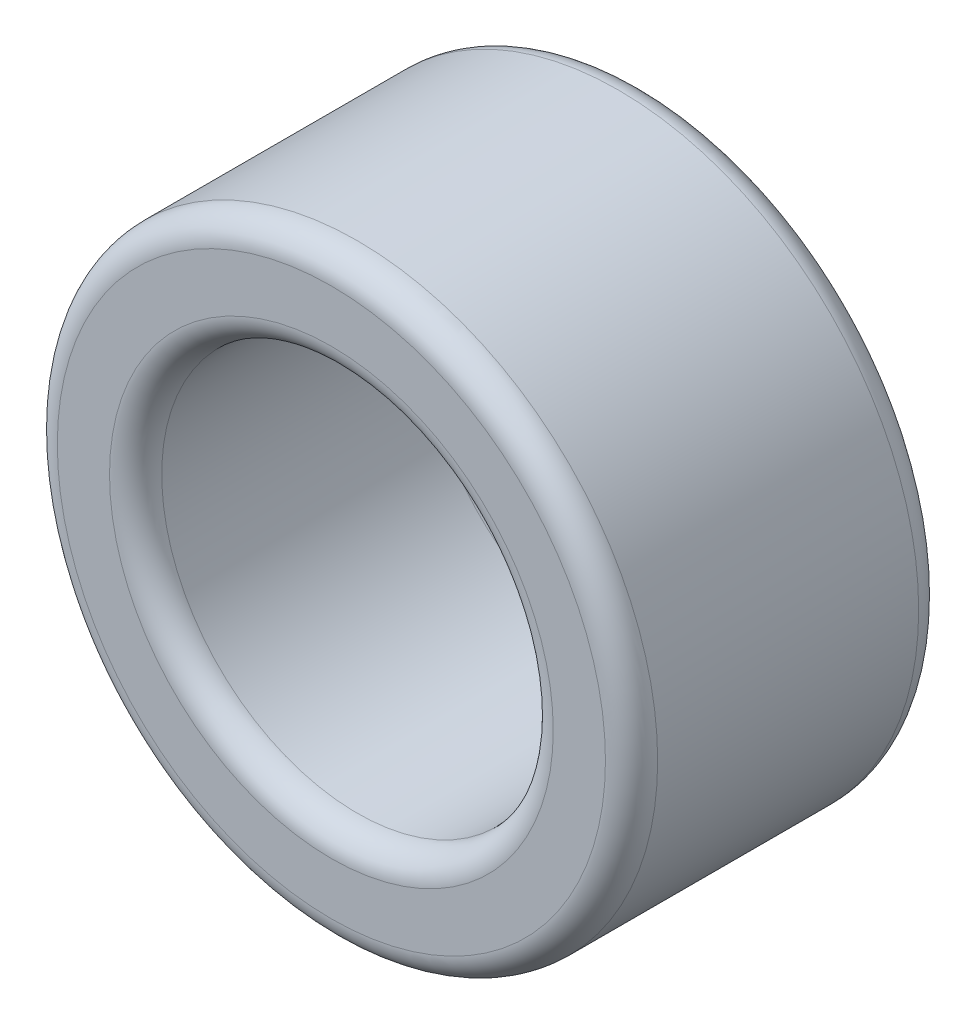
ISO-10303-21;
HEADER;
FILE_DESCRIPTION(('STEP AP214'),'2;1');
FILE_NAME('part.step','',(''),(''),'','','');
FILE_SCHEMA(('AUTOMOTIVE_DESIGN { 1 0 10303 214 1 1 1 1 }'));
ENDSEC;
DATA;
#1=APPLICATION_CONTEXT('core data for automotive mechanical design processes');
#2=APPLICATION_PROTOCOL_DEFINITION('international standard','automotive_design',2000,#1);
#3=PRODUCT_CONTEXT('',#1,'mechanical');
#4=PRODUCT('Part','Part','',(#3));
#5=PRODUCT_RELATED_PRODUCT_CATEGORY('part','',(#4));
#6=PRODUCT_DEFINITION_FORMATION('','',#4);
#7=PRODUCT_DEFINITION_CONTEXT('part definition',#1,'design');
#8=PRODUCT_DEFINITION('design','',#6,#7);
#9=PRODUCT_DEFINITION_SHAPE('','',#8);
#10=(LENGTH_UNIT() NAMED_UNIT(*) SI_UNIT(.MILLI.,.METRE.));
#11=(NAMED_UNIT(*) PLANE_ANGLE_UNIT() SI_UNIT($,.RADIAN.));
#12=(NAMED_UNIT(*) SI_UNIT($,.STERADIAN.) SOLID_ANGLE_UNIT());
#13=UNCERTAINTY_MEASURE_WITH_UNIT(LENGTH_MEASURE(1.E-05),#10,'distance_accuracy_value','');
#14=(GEOMETRIC_REPRESENTATION_CONTEXT(3) GLOBAL_UNCERTAINTY_ASSIGNED_CONTEXT((#13)) GLOBAL_UNIT_ASSIGNED_CONTEXT((#10,
#11,#12)) REPRESENTATION_CONTEXT('',''));
#15=CARTESIAN_POINT('',(0.,0.,0.));
#16=DIRECTION('',(0.,0.,1.));
#17=DIRECTION('',(1.,0.,0.));
#18=AXIS2_PLACEMENT_3D('',#15,#16,#17);
#19=CARTESIAN_POINT('',(0.,0.,1.2));
#20=DIRECTION('',(0.,0.,1.));
#21=DIRECTION('',(1.,0.,0.));
#22=AXIS2_PLACEMENT_3D('',#19,#20,#21);
#23=PLANE('',#22);
#24=CARTESIAN_POINT('',(0.,0.,1.2));
#25=DIRECTION('',(0.,0.,1.));
#26=DIRECTION('',(1.,0.,0.));
#27=AXIS2_PLACEMENT_3D('',#24,#25,#26);
#28=CIRCLE('',#27,1.05);
#29=CARTESIAN_POINT('',(1.05,0.,1.2));
#30=VERTEX_POINT('',#29);
#31=EDGE_CURVE('E10',#30,#30,#28,.T.);
#32=ORIENTED_EDGE('',*,*,#31,.T.);
#33=EDGE_LOOP('',(#32));
#34=FACE_BOUND('',#33,.T.);
#35=CARTESIAN_POINT('',(0.,0.,1.2));
#36=DIRECTION('',(0.,0.,1.));
#37=DIRECTION('',(1.,0.,0.));
#38=AXIS2_PLACEMENT_3D('',#35,#36,#37);
#39=CIRCLE('',#38,0.85);
#40=CARTESIAN_POINT('',(0.85,0.,1.2));
#41=VERTEX_POINT('',#40);
#42=EDGE_CURVE('E37',#41,#41,#39,.F.);
#43=ORIENTED_EDGE('',*,*,#42,.T.);
#44=EDGE_LOOP('',(#43));
#45=FACE_BOUND('',#44,.T.);
#46=ADVANCED_FACE('F30',(#34,#45),#23,.T.);
#47=CARTESIAN_POINT('',(0.,0.,0.));
#48=DIRECTION('',(0.,0.,1.));
#49=DIRECTION('',(1.,0.,0.));
#50=AXIS2_PLACEMENT_3D('',#47,#48,#49);
#51=PLANE('',#50);
#52=CARTESIAN_POINT('',(0.,0.,0.));
#53=DIRECTION('',(0.,0.,1.));
#54=DIRECTION('',(1.,0.,0.));
#55=AXIS2_PLACEMENT_3D('',#52,#53,#54);
#56=CIRCLE('',#55,0.85);
#57=CARTESIAN_POINT('',(0.85,0.,0.));
#58=VERTEX_POINT('',#57);
#59=EDGE_CURVE('E56',#58,#58,#56,.T.);
#60=ORIENTED_EDGE('',*,*,#59,.T.);
#61=EDGE_LOOP('',(#60));
#62=FACE_BOUND('',#61,.T.);
#63=CARTESIAN_POINT('',(0.,0.,0.));
#64=DIRECTION('',(0.,0.,1.));
#65=DIRECTION('',(1.,0.,0.));
#66=AXIS2_PLACEMENT_3D('',#63,#64,#65);
#67=CIRCLE('',#66,1.05);
#68=CARTESIAN_POINT('',(1.05,0.,0.));
#69=VERTEX_POINT('',#68);
#70=EDGE_CURVE('E59',#69,#69,#67,.F.);
#71=ORIENTED_EDGE('',*,*,#70,.T.);
#72=EDGE_LOOP('',(#71));
#73=FACE_BOUND('',#72,.T.);
#74=ADVANCED_FACE('F63',(#62,#73),#51,.F.);
#75=CARTESIAN_POINT('',(0.,0.,1.2));
#76=DIRECTION('',(0.,0.,-1.));
#77=DIRECTION('',(-1.,0.,0.));
#78=AXIS2_PLACEMENT_3D('',#75,#76,#77);
#79=CYLINDRICAL_SURFACE('',#78,1.15);
#80=CARTESIAN_POINT('',(0.,0.,0.1));
#81=DIRECTION('',(0.,0.,1.));
#82=DIRECTION('',(1.,0.,0.));
#83=AXIS2_PLACEMENT_3D('',#80,#81,#82);
#84=CIRCLE('',#83,1.15);
#85=CARTESIAN_POINT('',(1.15,0.,0.1));
#86=VERTEX_POINT('',#85);
#87=EDGE_CURVE('E41',#86,#86,#84,.T.);
#88=ORIENTED_EDGE('',*,*,#87,.T.);
#89=EDGE_LOOP('',(#88));
#90=FACE_BOUND('',#89,.T.);
#91=CARTESIAN_POINT('',(0.,0.,1.1));
#92=DIRECTION('',(0.,0.,1.));
#93=DIRECTION('',(1.,0.,0.));
#94=AXIS2_PLACEMENT_3D('',#91,#92,#93);
#95=CIRCLE('',#94,1.15);
#96=CARTESIAN_POINT('',(1.15,0.,1.1));
#97=VERTEX_POINT('',#96);
#98=EDGE_CURVE('E45',#97,#97,#95,.F.);
#99=ORIENTED_EDGE('',*,*,#98,.T.);
#100=EDGE_LOOP('',(#99));
#101=FACE_BOUND('',#100,.T.);
#102=ADVANCED_FACE('F73',(#90,#101),#79,.T.);
#103=CARTESIAN_POINT('',(0.,0.,1.2));
#104=DIRECTION('',(0.,0.,-1.));
#105=DIRECTION('',(-1.,0.,0.));
#106=AXIS2_PLACEMENT_3D('',#103,#104,#105);
#107=CYLINDRICAL_SURFACE('',#106,0.75);
#108=CARTESIAN_POINT('',(0.,0.,0.1));
#109=DIRECTION('',(0.,0.,1.));
#110=DIRECTION('',(1.,0.,0.));
#111=AXIS2_PLACEMENT_3D('',#108,#109,#110);
#112=CIRCLE('',#111,0.75);
#113=CARTESIAN_POINT('',(0.75,0.,0.1));
#114=VERTEX_POINT('',#113);
#115=EDGE_CURVE('E50',#114,#114,#112,.F.);
#116=ORIENTED_EDGE('',*,*,#115,.T.);
#117=EDGE_LOOP('',(#116));
#118=FACE_BOUND('',#117,.T.);
#119=CARTESIAN_POINT('',(0.,0.,1.1));
#120=DIRECTION('',(0.,0.,1.));
#121=DIRECTION('',(1.,0.,0.));
#122=AXIS2_PLACEMENT_3D('',#119,#120,#121);
#123=CIRCLE('',#122,0.75);
#124=CARTESIAN_POINT('',(0.75,0.,1.1));
#125=VERTEX_POINT('',#124);
#126=EDGE_CURVE('E53',#125,#125,#123,.T.);
#127=ORIENTED_EDGE('',*,*,#126,.T.);
#128=EDGE_LOOP('',(#127));
#129=FACE_BOUND('',#128,.T.);
#130=ADVANCED_FACE('F76',(#118,#129),#107,.F.);
#131=CARTESIAN_POINT('',(0.,0.,0.1));
#132=DIRECTION('',(0.,0.,1.));
#133=DIRECTION('',(1.,0.,0.));
#134=AXIS2_PLACEMENT_3D('',#131,#132,#133);
#135=TOROIDAL_SURFACE('',#134,0.85,0.1);
#136=ORIENTED_EDGE('',*,*,#115,.F.);
#137=EDGE_LOOP('',(#136));
#138=FACE_BOUND('',#137,.T.);
#139=ORIENTED_EDGE('',*,*,#59,.F.);
#140=EDGE_LOOP('',(#139));
#141=FACE_BOUND('',#140,.T.);
#142=ADVANCED_FACE('F69',(#138,#141),#135,.T.);
#143=CARTESIAN_POINT('',(0.,0.,0.1));
#144=DIRECTION('',(0.,0.,1.));
#145=DIRECTION('',(1.,0.,0.));
#146=AXIS2_PLACEMENT_3D('',#143,#144,#145);
#147=TOROIDAL_SURFACE('',#146,1.05,0.1);
#148=ORIENTED_EDGE('',*,*,#70,.F.);
#149=EDGE_LOOP('',(#148));
#150=FACE_BOUND('',#149,.T.);
#151=ORIENTED_EDGE('',*,*,#87,.F.);
#152=EDGE_LOOP('',(#151));
#153=FACE_BOUND('',#152,.T.);
#154=ADVANCED_FACE('F65',(#150,#153),#147,.T.);
#155=CARTESIAN_POINT('',(0.,0.,1.1));
#156=DIRECTION('',(0.,0.,1.));
#157=DIRECTION('',(1.,0.,0.));
#158=AXIS2_PLACEMENT_3D('',#155,#156,#157);
#159=TOROIDAL_SURFACE('',#158,1.05,0.1);
#160=ORIENTED_EDGE('',*,*,#98,.F.);
#161=EDGE_LOOP('',(#160));
#162=FACE_BOUND('',#161,.T.);
#163=ORIENTED_EDGE('',*,*,#31,.F.);
#164=EDGE_LOOP('',(#163));
#165=FACE_BOUND('',#164,.T.);
#166=ADVANCED_FACE('F68',(#162,#165),#159,.T.);
#167=CARTESIAN_POINT('',(0.,0.,1.1));
#168=DIRECTION('',(0.,0.,1.));
#169=DIRECTION('',(1.,0.,0.));
#170=AXIS2_PLACEMENT_3D('',#167,#168,#169);
#171=TOROIDAL_SURFACE('',#170,0.85,0.1);
#172=ORIENTED_EDGE('',*,*,#42,.F.);
#173=EDGE_LOOP('',(#172));
#174=FACE_BOUND('',#173,.T.);
#175=ORIENTED_EDGE('',*,*,#126,.F.);
#176=EDGE_LOOP('',(#175));
#177=FACE_BOUND('',#176,.T.);
#178=ADVANCED_FACE('F32',(#174,#177),#171,.T.);
#179=CLOSED_SHELL('',(#46,#74,#102,#130,#142,#154,#166,#178));
#180=MANIFOLD_SOLID_BREP('B2',#179);
#181=ADVANCED_BREP_SHAPE_REPRESENTATION('',(#18,#180),#14);
#182=SHAPE_DEFINITION_REPRESENTATION(#9,#181);
ENDSEC;
END-ISO-10303-21;
